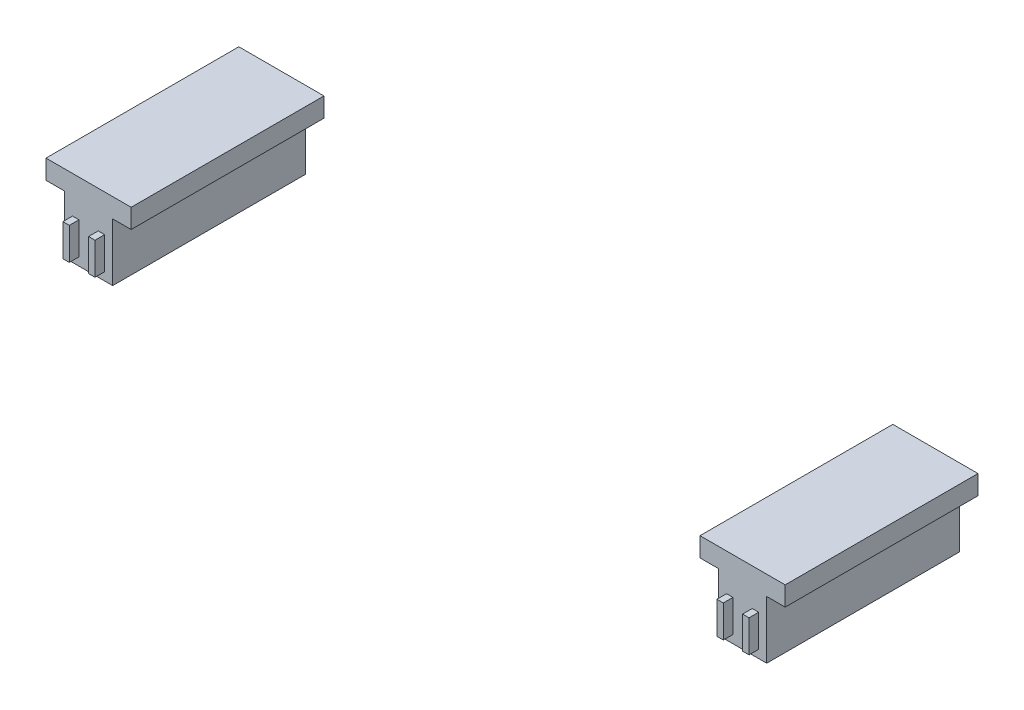
ISO-10303-21;
HEADER;
FILE_DESCRIPTION(('STEP AP214'),'2;1');
FILE_NAME('part.step','',(''),(''),'','','');
FILE_SCHEMA(('AUTOMOTIVE_DESIGN { 1 0 10303 214 1 1 1 1 }'));
ENDSEC;
DATA;
#1=APPLICATION_CONTEXT('core data for automotive mechanical design processes');
#2=APPLICATION_PROTOCOL_DEFINITION('international standard','automotive_design',2000,#1);
#3=PRODUCT_CONTEXT('',#1,'mechanical');
#4=PRODUCT('Part','Part','',(#3));
#5=PRODUCT_RELATED_PRODUCT_CATEGORY('part','',(#4));
#6=PRODUCT_DEFINITION_FORMATION('','',#4);
#7=PRODUCT_DEFINITION_CONTEXT('part definition',#1,'design');
#8=PRODUCT_DEFINITION('design','',#6,#7);
#9=PRODUCT_DEFINITION_SHAPE('','',#8);
#10=(LENGTH_UNIT() NAMED_UNIT(*) SI_UNIT(.MILLI.,.METRE.));
#11=(NAMED_UNIT(*) PLANE_ANGLE_UNIT() SI_UNIT($,.RADIAN.));
#12=(NAMED_UNIT(*) SI_UNIT($,.STERADIAN.) SOLID_ANGLE_UNIT());
#13=UNCERTAINTY_MEASURE_WITH_UNIT(LENGTH_MEASURE(1.E-05),#10,'distance_accuracy_value','');
#14=(GEOMETRIC_REPRESENTATION_CONTEXT(3) GLOBAL_UNCERTAINTY_ASSIGNED_CONTEXT((#13)) GLOBAL_UNIT_ASSIGNED_CONTEXT((#10,
#11,#12)) REPRESENTATION_CONTEXT('',''));
#15=CARTESIAN_POINT('',(0.,0.,0.));
#16=DIRECTION('',(0.,0.,1.));
#17=DIRECTION('',(1.,0.,0.));
#18=AXIS2_PLACEMENT_3D('',#15,#16,#17);
#19=CARTESIAN_POINT('',(0.,0.,60.));
#20=DIRECTION('',(0.,0.,1.));
#21=DIRECTION('',(1.,0.,0.));
#22=AXIS2_PLACEMENT_3D('',#19,#20,#21);
#23=PLANE('',#22);
#24=DIRECTION('',(1.,0.,0.));
#25=VECTOR('',#24,1.);
#26=CARTESIAN_POINT('',(-50.766255203223,-7.74000489882641,60.));
#27=LINE('',#26,#25);
#28=CARTESIAN_POINT('',(-56.516255203223,-7.74000489882641,60.));
#29=VERTEX_POINT('',#28);
#30=CARTESIAN_POINT('',(-50.766255203223,-7.74000489882641,60.));
#31=VERTEX_POINT('',#30);
#32=EDGE_CURVE('E214',#29,#31,#27,.T.);
#33=ORIENTED_EDGE('',*,*,#32,.T.);
#34=DIRECTION('',(0.,1.,0.));
#35=VECTOR('',#34,1.);
#36=CARTESIAN_POINT('',(-50.766255203223,-1.74000489882641,60.));
#37=LINE('',#36,#35);
#38=CARTESIAN_POINT('',(-50.766255203223,-1.74000489882641,60.));
#39=VERTEX_POINT('',#38);
#40=EDGE_CURVE('E217',#31,#39,#37,.T.);
#41=ORIENTED_EDGE('',*,*,#40,.T.);
#42=DIRECTION('',(-1.,0.,0.));
#43=VECTOR('',#42,1.);
#44=CARTESIAN_POINT('',(-77.266255203223,-1.74000489882641,60.));
#45=LINE('',#44,#43);
#46=CARTESIAN_POINT('',(-77.266255203223,-1.74000489882641,60.));
#47=VERTEX_POINT('',#46);
#48=EDGE_CURVE('E220',#39,#47,#45,.T.);
#49=ORIENTED_EDGE('',*,*,#48,.T.);
#50=DIRECTION('',(0.,-1.,0.));
#51=VECTOR('',#50,1.);
#52=CARTESIAN_POINT('',(-77.266255203223,-7.74000489882641,60.));
#53=LINE('',#52,#51);
#54=CARTESIAN_POINT('',(-77.266255203223,-7.74000489882641,60.));
#55=VERTEX_POINT('',#54);
#56=EDGE_CURVE('E222',#47,#55,#53,.T.);
#57=ORIENTED_EDGE('',*,*,#56,.T.);
#58=DIRECTION('',(1.,0.,0.));
#59=VECTOR('',#58,1.);
#60=CARTESIAN_POINT('',(-71.516255203223,-7.74000489882641,60.));
#61=LINE('',#60,#59);
#62=CARTESIAN_POINT('',(-71.516255203223,-7.74000489882641,60.));
#63=VERTEX_POINT('',#62);
#64=EDGE_CURVE('E224',#55,#63,#61,.T.);
#65=ORIENTED_EDGE('',*,*,#64,.T.);
#66=DIRECTION('',(0.,-1.,0.));
#67=VECTOR('',#66,1.);
#68=CARTESIAN_POINT('',(-71.516255203223,-25.7400048988264,60.));
#69=LINE('',#68,#67);
#70=CARTESIAN_POINT('',(-71.516255203223,-25.7400048988264,60.));
#71=VERTEX_POINT('',#70);
#72=EDGE_CURVE('E226',#63,#71,#69,.T.);
#73=ORIENTED_EDGE('',*,*,#72,.T.);
#74=DIRECTION('',(1.,0.,0.));
#75=VECTOR('',#74,1.);
#76=CARTESIAN_POINT('',(-56.516255203223,-25.7400048988264,60.));
#77=LINE('',#76,#75);
#78=CARTESIAN_POINT('',(-56.516255203223,-25.7400048988264,60.));
#79=VERTEX_POINT('',#78);
#80=EDGE_CURVE('E228',#71,#79,#77,.T.);
#81=ORIENTED_EDGE('',*,*,#80,.T.);
#82=DIRECTION('',(0.,1.,0.));
#83=VECTOR('',#82,1.);
#84=CARTESIAN_POINT('',(-56.516255203223,-7.74000489882641,60.));
#85=LINE('',#84,#83);
#86=EDGE_CURVE('E230',#79,#29,#85,.T.);
#87=ORIENTED_EDGE('',*,*,#86,.T.);
#88=EDGE_LOOP('',(#33,#41,#49,#57,#65,#73,#81,#87));
#89=FACE_BOUND('',#88,.T.);
#90=DIRECTION('',(0.,1.,0.));
#91=VECTOR('',#90,1.);
#92=CARTESIAN_POINT('',(-67.016255203223,-13.2400048988264,60.));
#93=LINE('',#92,#91);
#94=CARTESIAN_POINT('',(-67.016255203223,-23.2400048988264,60.));
#95=VERTEX_POINT('',#94);
#96=CARTESIAN_POINT('',(-67.016255203223,-13.2400048988264,60.));
#97=VERTEX_POINT('',#96);
#98=EDGE_CURVE('E185',#95,#97,#93,.T.);
#99=ORIENTED_EDGE('',*,*,#98,.F.);
#100=DIRECTION('',(1.,0.,0.));
#101=VECTOR('',#100,1.);
#102=CARTESIAN_POINT('',(-67.016255203223,-23.2400048988264,60.));
#103=LINE('',#102,#101);
#104=CARTESIAN_POINT('',(-69.016255203223,-23.2400048988264,60.));
#105=VERTEX_POINT('',#104);
#106=EDGE_CURVE('E182',#105,#95,#103,.T.);
#107=ORIENTED_EDGE('',*,*,#106,.F.);
#108=DIRECTION('',(0.,-1.,0.));
#109=VECTOR('',#108,1.);
#110=CARTESIAN_POINT('',(-69.016255203223,-23.2400048988264,60.));
#111=LINE('',#110,#109);
#112=CARTESIAN_POINT('',(-69.016255203223,-13.2400048988264,60.));
#113=VERTEX_POINT('',#112);
#114=EDGE_CURVE('E194',#113,#105,#111,.T.);
#115=ORIENTED_EDGE('',*,*,#114,.F.);
#116=DIRECTION('',(-1.,0.,0.));
#117=VECTOR('',#116,1.);
#118=CARTESIAN_POINT('',(-69.016255203223,-13.2400048988264,60.));
#119=LINE('',#118,#117);
#120=EDGE_CURVE('E202',#97,#113,#119,.T.);
#121=ORIENTED_EDGE('',*,*,#120,.F.);
#122=EDGE_LOOP('',(#99,#107,#115,#121));
#123=FACE_BOUND('',#122,.T.);
#124=DIRECTION('',(0.,-1.,0.));
#125=VECTOR('',#124,1.);
#126=CARTESIAN_POINT('',(-61.016255203223,-23.2400048988264,60.));
#127=LINE('',#126,#125);
#128=CARTESIAN_POINT('',(-61.016255203223,-13.2400048988264,60.));
#129=VERTEX_POINT('',#128);
#130=CARTESIAN_POINT('',(-61.016255203223,-23.2400048988264,60.));
#131=VERTEX_POINT('',#130);
#132=EDGE_CURVE('E483',#129,#131,#127,.T.);
#133=ORIENTED_EDGE('',*,*,#132,.F.);
#134=DIRECTION('',(-1.,0.,0.));
#135=VECTOR('',#134,1.);
#136=CARTESIAN_POINT('',(-61.016255203223,-13.2400048988264,60.));
#137=LINE('',#136,#135);
#138=CARTESIAN_POINT('',(-59.016255203223,-13.2400048988264,60.));
#139=VERTEX_POINT('',#138);
#140=EDGE_CURVE('E180',#139,#129,#137,.T.);
#141=ORIENTED_EDGE('',*,*,#140,.F.);
#142=DIRECTION('',(0.,1.,0.));
#143=VECTOR('',#142,1.);
#144=CARTESIAN_POINT('',(-59.016255203223,-13.2400048988264,60.));
#145=LINE('',#144,#143);
#146=CARTESIAN_POINT('',(-59.016255203223,-23.2400048988264,60.));
#147=VERTEX_POINT('',#146);
#148=EDGE_CURVE('E176',#147,#139,#145,.T.);
#149=ORIENTED_EDGE('',*,*,#148,.F.);
#150=DIRECTION('',(1.,0.,0.));
#151=VECTOR('',#150,1.);
#152=CARTESIAN_POINT('',(-59.016255203223,-23.2400048988264,60.));
#153=LINE('',#152,#151);
#154=EDGE_CURVE('E480',#131,#147,#153,.T.);
#155=ORIENTED_EDGE('',*,*,#154,.F.);
#156=EDGE_LOOP('',(#133,#141,#149,#155));
#157=FACE_BOUND('',#156,.T.);
#158=ADVANCED_FACE('F43',(#89,#123,#157),#23,.T.);
#159=CARTESIAN_POINT('',(-50.766255203223,-7.74000489882641,60.));
#160=DIRECTION('',(0.,1.,0.));
#161=DIRECTION('',(0.,0.,1.));
#162=AXIS2_PLACEMENT_3D('',#159,#160,#161);
#163=PLANE('',#162);
#164=DIRECTION('',(1.,0.,0.));
#165=VECTOR('',#164,1.);
#166=CARTESIAN_POINT('',(-50.766255203223,-7.74000489882641,0.));
#167=LINE('',#166,#165);
#168=CARTESIAN_POINT('',(-56.516255203223,-7.74000489882641,0.));
#169=VERTEX_POINT('',#168);
#170=CARTESIAN_POINT('',(-50.766255203223,-7.74000489882641,0.));
#171=VERTEX_POINT('',#170);
#172=EDGE_CURVE('E213',#169,#171,#167,.T.);
#173=ORIENTED_EDGE('',*,*,#172,.T.);
#174=DIRECTION('',(0.,0.,-1.));
#175=VECTOR('',#174,1.);
#176=CARTESIAN_POINT('',(-50.766255203223,-7.74000489882641,60.));
#177=LINE('',#176,#175);
#178=EDGE_CURVE('E12',#31,#171,#177,.T.);
#179=ORIENTED_EDGE('',*,*,#178,.F.);
#180=ORIENTED_EDGE('',*,*,#32,.F.);
#181=DIRECTION('',(0.,0.,-1.));
#182=VECTOR('',#181,1.);
#183=CARTESIAN_POINT('',(-56.516255203223,-7.74000489882641,60.));
#184=LINE('',#183,#182);
#185=EDGE_CURVE('E232',#29,#169,#184,.T.);
#186=ORIENTED_EDGE('',*,*,#185,.T.);
#187=EDGE_LOOP('',(#173,#179,#180,#186));
#188=FACE_BOUND('',#187,.T.);
#189=ADVANCED_FACE('F45',(#188),#163,.F.);
#190=CARTESIAN_POINT('',(-50.766255203223,-1.74000489882641,60.));
#191=DIRECTION('',(-1.,0.,0.));
#192=DIRECTION('',(0.,0.,1.));
#193=AXIS2_PLACEMENT_3D('',#190,#191,#192);
#194=PLANE('',#193);
#195=DIRECTION('',(0.,1.,0.));
#196=VECTOR('',#195,1.);
#197=CARTESIAN_POINT('',(-50.766255203223,-1.74000489882641,0.));
#198=LINE('',#197,#196);
#199=CARTESIAN_POINT('',(-50.766255203223,-1.74000489882641,0.));
#200=VERTEX_POINT('',#199);
#201=EDGE_CURVE('E235',#171,#200,#198,.T.);
#202=ORIENTED_EDGE('',*,*,#201,.T.);
#203=DIRECTION('',(0.,0.,-1.));
#204=VECTOR('',#203,1.);
#205=CARTESIAN_POINT('',(-50.766255203223,-1.74000489882641,60.));
#206=LINE('',#205,#204);
#207=EDGE_CURVE('E51',#39,#200,#206,.T.);
#208=ORIENTED_EDGE('',*,*,#207,.F.);
#209=ORIENTED_EDGE('',*,*,#40,.F.);
#210=ORIENTED_EDGE('',*,*,#178,.T.);
#211=EDGE_LOOP('',(#202,#208,#209,#210));
#212=FACE_BOUND('',#211,.T.);
#213=ADVANCED_FACE('F292',(#212),#194,.F.);
#214=CARTESIAN_POINT('',(-77.266255203223,-1.74000489882641,60.));
#215=DIRECTION('',(0.,-1.,0.));
#216=DIRECTION('',(0.,0.,-1.));
#217=AXIS2_PLACEMENT_3D('',#214,#215,#216);
#218=PLANE('',#217);
#219=DIRECTION('',(-1.,0.,0.));
#220=VECTOR('',#219,1.);
#221=CARTESIAN_POINT('',(-77.266255203223,-1.74000489882641,0.));
#222=LINE('',#221,#220);
#223=CARTESIAN_POINT('',(-77.266255203223,-1.74000489882641,0.));
#224=VERTEX_POINT('',#223);
#225=EDGE_CURVE('E237',#200,#224,#222,.T.);
#226=ORIENTED_EDGE('',*,*,#225,.T.);
#227=DIRECTION('',(0.,0.,-1.));
#228=VECTOR('',#227,1.);
#229=CARTESIAN_POINT('',(-77.266255203223,-1.74000489882641,60.));
#230=LINE('',#229,#228);
#231=EDGE_CURVE('E262',#47,#224,#230,.T.);
#232=ORIENTED_EDGE('',*,*,#231,.F.);
#233=ORIENTED_EDGE('',*,*,#48,.F.);
#234=ORIENTED_EDGE('',*,*,#207,.T.);
#235=EDGE_LOOP('',(#226,#232,#233,#234));
#236=FACE_BOUND('',#235,.T.);
#237=ADVANCED_FACE('F269',(#236),#218,.F.);
#238=CARTESIAN_POINT('',(-77.266255203223,-7.74000489882641,60.));
#239=DIRECTION('',(1.,0.,0.));
#240=DIRECTION('',(0.,0.,-1.));
#241=AXIS2_PLACEMENT_3D('',#238,#239,#240);
#242=PLANE('',#241);
#243=DIRECTION('',(0.,-1.,0.));
#244=VECTOR('',#243,1.);
#245=CARTESIAN_POINT('',(-77.266255203223,-7.74000489882641,0.));
#246=LINE('',#245,#244);
#247=CARTESIAN_POINT('',(-77.266255203223,-7.74000489882641,0.));
#248=VERTEX_POINT('',#247);
#249=EDGE_CURVE('E239',#224,#248,#246,.T.);
#250=ORIENTED_EDGE('',*,*,#249,.T.);
#251=DIRECTION('',(0.,0.,-1.));
#252=VECTOR('',#251,1.);
#253=CARTESIAN_POINT('',(-77.266255203223,-7.74000489882641,60.));
#254=LINE('',#253,#252);
#255=EDGE_CURVE('E259',#55,#248,#254,.T.);
#256=ORIENTED_EDGE('',*,*,#255,.F.);
#257=ORIENTED_EDGE('',*,*,#56,.F.);
#258=ORIENTED_EDGE('',*,*,#231,.T.);
#259=EDGE_LOOP('',(#250,#256,#257,#258));
#260=FACE_BOUND('',#259,.T.);
#261=ADVANCED_FACE('F280',(#260),#242,.F.);
#262=CARTESIAN_POINT('',(-71.516255203223,-7.74000489882641,60.));
#263=DIRECTION('',(0.,1.,0.));
#264=DIRECTION('',(0.,0.,1.));
#265=AXIS2_PLACEMENT_3D('',#262,#263,#264);
#266=PLANE('',#265);
#267=DIRECTION('',(1.,0.,0.));
#268=VECTOR('',#267,1.);
#269=CARTESIAN_POINT('',(-71.516255203223,-7.74000489882641,0.));
#270=LINE('',#269,#268);
#271=CARTESIAN_POINT('',(-71.516255203223,-7.74000489882641,0.));
#272=VERTEX_POINT('',#271);
#273=EDGE_CURVE('E241',#248,#272,#270,.T.);
#274=ORIENTED_EDGE('',*,*,#273,.T.);
#275=DIRECTION('',(0.,0.,-1.));
#276=VECTOR('',#275,1.);
#277=CARTESIAN_POINT('',(-71.516255203223,-7.74000489882641,60.));
#278=LINE('',#277,#276);
#279=EDGE_CURVE('E256',#63,#272,#278,.T.);
#280=ORIENTED_EDGE('',*,*,#279,.F.);
#281=ORIENTED_EDGE('',*,*,#64,.F.);
#282=ORIENTED_EDGE('',*,*,#255,.T.);
#283=EDGE_LOOP('',(#274,#280,#281,#282));
#284=FACE_BOUND('',#283,.T.);
#285=ADVANCED_FACE('F284',(#284),#266,.F.);
#286=CARTESIAN_POINT('',(-71.516255203223,-25.7400048988264,60.));
#287=DIRECTION('',(1.,0.,0.));
#288=DIRECTION('',(0.,0.,-1.));
#289=AXIS2_PLACEMENT_3D('',#286,#287,#288);
#290=PLANE('',#289);
#291=DIRECTION('',(0.,-1.,0.));
#292=VECTOR('',#291,1.);
#293=CARTESIAN_POINT('',(-71.516255203223,-25.7400048988264,0.));
#294=LINE('',#293,#292);
#295=CARTESIAN_POINT('',(-71.516255203223,-25.7400048988264,0.));
#296=VERTEX_POINT('',#295);
#297=EDGE_CURVE('E243',#272,#296,#294,.T.);
#298=ORIENTED_EDGE('',*,*,#297,.T.);
#299=DIRECTION('',(0.,0.,-1.));
#300=VECTOR('',#299,1.);
#301=CARTESIAN_POINT('',(-71.516255203223,-25.7400048988264,60.));
#302=LINE('',#301,#300);
#303=EDGE_CURVE('E253',#71,#296,#302,.T.);
#304=ORIENTED_EDGE('',*,*,#303,.F.);
#305=ORIENTED_EDGE('',*,*,#72,.F.);
#306=ORIENTED_EDGE('',*,*,#279,.T.);
#307=EDGE_LOOP('',(#298,#304,#305,#306));
#308=FACE_BOUND('',#307,.T.);
#309=ADVANCED_FACE('F305',(#308),#290,.F.);
#310=CARTESIAN_POINT('',(-56.516255203223,-25.7400048988264,60.));
#311=DIRECTION('',(0.,1.,0.));
#312=DIRECTION('',(0.,0.,1.));
#313=AXIS2_PLACEMENT_3D('',#310,#311,#312);
#314=PLANE('',#313);
#315=DIRECTION('',(1.,0.,0.));
#316=VECTOR('',#315,1.);
#317=CARTESIAN_POINT('',(-56.516255203223,-25.7400048988264,0.));
#318=LINE('',#317,#316);
#319=CARTESIAN_POINT('',(-56.516255203223,-25.7400048988264,0.));
#320=VERTEX_POINT('',#319);
#321=EDGE_CURVE('E245',#296,#320,#318,.T.);
#322=ORIENTED_EDGE('',*,*,#321,.T.);
#323=DIRECTION('',(0.,0.,-1.));
#324=VECTOR('',#323,1.);
#325=CARTESIAN_POINT('',(-56.516255203223,-25.7400048988264,60.));
#326=LINE('',#325,#324);
#327=EDGE_CURVE('E250',#79,#320,#326,.T.);
#328=ORIENTED_EDGE('',*,*,#327,.F.);
#329=ORIENTED_EDGE('',*,*,#80,.F.);
#330=ORIENTED_EDGE('',*,*,#303,.T.);
#331=EDGE_LOOP('',(#322,#328,#329,#330));
#332=FACE_BOUND('',#331,.T.);
#333=ADVANCED_FACE('F303',(#332),#314,.F.);
#334=CARTESIAN_POINT('',(-56.516255203223,-7.74000489882641,60.));
#335=DIRECTION('',(-1.,0.,0.));
#336=DIRECTION('',(0.,0.,1.));
#337=AXIS2_PLACEMENT_3D('',#334,#335,#336);
#338=PLANE('',#337);
#339=DIRECTION('',(0.,1.,0.));
#340=VECTOR('',#339,1.);
#341=CARTESIAN_POINT('',(-56.516255203223,-7.74000489882641,0.));
#342=LINE('',#341,#340);
#343=EDGE_CURVE('E218',#320,#169,#342,.T.);
#344=ORIENTED_EDGE('',*,*,#343,.T.);
#345=ORIENTED_EDGE('',*,*,#185,.F.);
#346=ORIENTED_EDGE('',*,*,#86,.F.);
#347=ORIENTED_EDGE('',*,*,#327,.T.);
#348=EDGE_LOOP('',(#344,#345,#346,#347));
#349=FACE_BOUND('',#348,.T.);
#350=ADVANCED_FACE('F298',(#349),#338,.F.);
#351=CARTESIAN_POINT('',(0.,0.,0.));
#352=DIRECTION('',(0.,0.,1.));
#353=DIRECTION('',(1.,0.,0.));
#354=AXIS2_PLACEMENT_3D('',#351,#352,#353);
#355=PLANE('',#354);
#356=ORIENTED_EDGE('',*,*,#172,.F.);
#357=ORIENTED_EDGE('',*,*,#343,.F.);
#358=ORIENTED_EDGE('',*,*,#321,.F.);
#359=ORIENTED_EDGE('',*,*,#297,.F.);
#360=ORIENTED_EDGE('',*,*,#273,.F.);
#361=ORIENTED_EDGE('',*,*,#249,.F.);
#362=ORIENTED_EDGE('',*,*,#225,.F.);
#363=ORIENTED_EDGE('',*,*,#201,.F.);
#364=EDGE_LOOP('',(#356,#357,#358,#359,#360,#361,#362,#363));
#365=FACE_BOUND('',#364,.T.);
#366=ADVANCED_FACE('F275',(#365),#355,.F.);
#367=CARTESIAN_POINT('',(-67.016255203223,-23.2400048988264,63.));
#368=DIRECTION('',(0.,1.,0.));
#369=DIRECTION('',(0.,0.,1.));
#370=AXIS2_PLACEMENT_3D('',#367,#368,#369);
#371=PLANE('',#370);
#372=ORIENTED_EDGE('',*,*,#106,.T.);
#373=DIRECTION('',(0.,0.,-1.));
#374=VECTOR('',#373,1.);
#375=CARTESIAN_POINT('',(-67.016255203223,-23.2400048988264,63.));
#376=LINE('',#375,#374);
#377=CARTESIAN_POINT('',(-67.016255203223,-23.2400048988264,63.));
#378=VERTEX_POINT('',#377);
#379=EDGE_CURVE('E211',#378,#95,#376,.T.);
#380=ORIENTED_EDGE('',*,*,#379,.F.);
#381=DIRECTION('',(1.,0.,0.));
#382=VECTOR('',#381,1.);
#383=CARTESIAN_POINT('',(-67.016255203223,-23.2400048988264,63.));
#384=LINE('',#383,#382);
#385=CARTESIAN_POINT('',(-69.016255203223,-23.2400048988264,63.));
#386=VERTEX_POINT('',#385);
#387=EDGE_CURVE('E190',#386,#378,#384,.T.);
#388=ORIENTED_EDGE('',*,*,#387,.F.);
#389=DIRECTION('',(0.,0.,-1.));
#390=VECTOR('',#389,1.);
#391=CARTESIAN_POINT('',(-69.016255203223,-23.2400048988264,63.));
#392=LINE('',#391,#390);
#393=EDGE_CURVE('E199',#386,#105,#392,.T.);
#394=ORIENTED_EDGE('',*,*,#393,.T.);
#395=EDGE_LOOP('',(#372,#380,#388,#394));
#396=FACE_BOUND('',#395,.T.);
#397=ADVANCED_FACE('F321',(#396),#371,.F.);
#398=CARTESIAN_POINT('',(-67.016255203223,-13.2400048988264,63.));
#399=DIRECTION('',(-1.,0.,0.));
#400=DIRECTION('',(0.,0.,1.));
#401=AXIS2_PLACEMENT_3D('',#398,#399,#400);
#402=PLANE('',#401);
#403=ORIENTED_EDGE('',*,*,#98,.T.);
#404=DIRECTION('',(0.,0.,-1.));
#405=VECTOR('',#404,1.);
#406=CARTESIAN_POINT('',(-67.016255203223,-13.2400048988264,63.));
#407=LINE('',#406,#405);
#408=CARTESIAN_POINT('',(-67.016255203223,-13.2400048988264,63.));
#409=VERTEX_POINT('',#408);
#410=EDGE_CURVE('E208',#409,#97,#407,.T.);
#411=ORIENTED_EDGE('',*,*,#410,.F.);
#412=DIRECTION('',(0.,1.,0.));
#413=VECTOR('',#412,1.);
#414=CARTESIAN_POINT('',(-67.016255203223,-13.2400048988264,63.));
#415=LINE('',#414,#413);
#416=EDGE_CURVE('E193',#378,#409,#415,.T.);
#417=ORIENTED_EDGE('',*,*,#416,.F.);
#418=ORIENTED_EDGE('',*,*,#379,.T.);
#419=EDGE_LOOP('',(#403,#411,#417,#418));
#420=FACE_BOUND('',#419,.T.);
#421=ADVANCED_FACE('F340',(#420),#402,.F.);
#422=CARTESIAN_POINT('',(-69.016255203223,-13.2400048988264,63.));
#423=DIRECTION('',(0.,-1.,0.));
#424=DIRECTION('',(0.,0.,-1.));
#425=AXIS2_PLACEMENT_3D('',#422,#423,#424);
#426=PLANE('',#425);
#427=ORIENTED_EDGE('',*,*,#120,.T.);
#428=DIRECTION('',(0.,0.,-1.));
#429=VECTOR('',#428,1.);
#430=CARTESIAN_POINT('',(-69.016255203223,-13.2400048988264,63.));
#431=LINE('',#430,#429);
#432=CARTESIAN_POINT('',(-69.016255203223,-13.2400048988264,63.));
#433=VERTEX_POINT('',#432);
#434=EDGE_CURVE('E66',#433,#113,#431,.T.);
#435=ORIENTED_EDGE('',*,*,#434,.F.);
#436=DIRECTION('',(-1.,0.,0.));
#437=VECTOR('',#436,1.);
#438=CARTESIAN_POINT('',(-69.016255203223,-13.2400048988264,63.));
#439=LINE('',#438,#437);
#440=EDGE_CURVE('E196',#409,#433,#439,.T.);
#441=ORIENTED_EDGE('',*,*,#440,.F.);
#442=ORIENTED_EDGE('',*,*,#410,.T.);
#443=EDGE_LOOP('',(#427,#435,#441,#442));
#444=FACE_BOUND('',#443,.T.);
#445=ADVANCED_FACE('F347',(#444),#426,.F.);
#446=CARTESIAN_POINT('',(-69.016255203223,-23.2400048988264,63.));
#447=DIRECTION('',(1.,0.,0.));
#448=DIRECTION('',(0.,0.,-1.));
#449=AXIS2_PLACEMENT_3D('',#446,#447,#448);
#450=PLANE('',#449);
#451=ORIENTED_EDGE('',*,*,#114,.T.);
#452=ORIENTED_EDGE('',*,*,#393,.F.);
#453=DIRECTION('',(0.,-1.,0.));
#454=VECTOR('',#453,1.);
#455=CARTESIAN_POINT('',(-69.016255203223,-23.2400048988264,63.));
#456=LINE('',#455,#454);
#457=EDGE_CURVE('E198',#433,#386,#456,.T.);
#458=ORIENTED_EDGE('',*,*,#457,.F.);
#459=ORIENTED_EDGE('',*,*,#434,.T.);
#460=EDGE_LOOP('',(#451,#452,#458,#459));
#461=FACE_BOUND('',#460,.T.);
#462=ADVANCED_FACE('F354',(#461),#450,.F.);
#463=CARTESIAN_POINT('',(0.,0.,63.));
#464=DIRECTION('',(0.,0.,-1.));
#465=DIRECTION('',(-1.,0.,0.));
#466=AXIS2_PLACEMENT_3D('',#463,#464,#465);
#467=PLANE('',#466);
#468=ORIENTED_EDGE('',*,*,#387,.T.);
#469=ORIENTED_EDGE('',*,*,#416,.T.);
#470=ORIENTED_EDGE('',*,*,#440,.T.);
#471=ORIENTED_EDGE('',*,*,#457,.T.);
#472=EDGE_LOOP('',(#468,#469,#470,#471));
#473=FACE_BOUND('',#472,.T.);
#474=ADVANCED_FACE('F362',(#473),#467,.F.);
#475=CARTESIAN_POINT('',(-61.016255203223,-13.2400048988264,63.));
#476=DIRECTION('',(0.,-1.,0.));
#477=DIRECTION('',(0.,0.,-1.));
#478=AXIS2_PLACEMENT_3D('',#475,#476,#477);
#479=PLANE('',#478);
#480=ORIENTED_EDGE('',*,*,#140,.T.);
#481=DIRECTION('',(0.,0.,-1.));
#482=VECTOR('',#481,1.);
#483=CARTESIAN_POINT('',(-61.016255203223,-13.2400048988264,63.));
#484=LINE('',#483,#482);
#485=CARTESIAN_POINT('',(-61.016255203223,-13.2400048988264,63.));
#486=VERTEX_POINT('',#485);
#487=EDGE_CURVE('E161',#486,#129,#484,.T.);
#488=ORIENTED_EDGE('',*,*,#487,.F.);
#489=DIRECTION('',(-1.,0.,0.));
#490=VECTOR('',#489,1.);
#491=CARTESIAN_POINT('',(-61.016255203223,-13.2400048988264,63.));
#492=LINE('',#491,#490);
#493=CARTESIAN_POINT('',(-59.016255203223,-13.2400048988264,63.));
#494=VERTEX_POINT('',#493);
#495=EDGE_CURVE('E168',#494,#486,#492,.T.);
#496=ORIENTED_EDGE('',*,*,#495,.F.);
#497=DIRECTION('',(0.,0.,-1.));
#498=VECTOR('',#497,1.);
#499=CARTESIAN_POINT('',(-59.016255203223,-13.2400048988264,63.));
#500=LINE('',#499,#498);
#501=EDGE_CURVE('E477',#494,#139,#500,.T.);
#502=ORIENTED_EDGE('',*,*,#501,.T.);
#503=EDGE_LOOP('',(#480,#488,#496,#502));
#504=FACE_BOUND('',#503,.T.);
#505=ADVANCED_FACE('F178',(#504),#479,.F.);
#506=CARTESIAN_POINT('',(-61.016255203223,-23.2400048988264,63.));
#507=DIRECTION('',(1.,0.,0.));
#508=DIRECTION('',(0.,0.,-1.));
#509=AXIS2_PLACEMENT_3D('',#506,#507,#508);
#510=PLANE('',#509);
#511=ORIENTED_EDGE('',*,*,#132,.T.);
#512=DIRECTION('',(0.,0.,-1.));
#513=VECTOR('',#512,1.);
#514=CARTESIAN_POINT('',(-61.016255203223,-23.2400048988264,63.));
#515=LINE('',#514,#513);
#516=CARTESIAN_POINT('',(-61.016255203223,-23.2400048988264,63.));
#517=VERTEX_POINT('',#516);
#518=EDGE_CURVE('E164',#517,#131,#515,.T.);
#519=ORIENTED_EDGE('',*,*,#518,.F.);
#520=DIRECTION('',(0.,-1.,0.));
#521=VECTOR('',#520,1.);
#522=CARTESIAN_POINT('',(-61.016255203223,-23.2400048988264,63.));
#523=LINE('',#522,#521);
#524=EDGE_CURVE('E157',#486,#517,#523,.T.);
#525=ORIENTED_EDGE('',*,*,#524,.F.);
#526=ORIENTED_EDGE('',*,*,#487,.T.);
#527=EDGE_LOOP('',(#511,#519,#525,#526));
#528=FACE_BOUND('',#527,.T.);
#529=ADVANCED_FACE('F159',(#528),#510,.F.);
#530=CARTESIAN_POINT('',(-59.016255203223,-23.2400048988264,63.));
#531=DIRECTION('',(0.,1.,0.));
#532=DIRECTION('',(0.,0.,1.));
#533=AXIS2_PLACEMENT_3D('',#530,#531,#532);
#534=PLANE('',#533);
#535=ORIENTED_EDGE('',*,*,#154,.T.);
#536=DIRECTION('',(0.,0.,-1.));
#537=VECTOR('',#536,1.);
#538=CARTESIAN_POINT('',(-59.016255203223,-23.2400048988264,63.));
#539=LINE('',#538,#537);
#540=CARTESIAN_POINT('',(-59.016255203223,-23.2400048988264,63.));
#541=VERTEX_POINT('',#540);
#542=EDGE_CURVE('E58',#541,#147,#539,.T.);
#543=ORIENTED_EDGE('',*,*,#542,.F.);
#544=DIRECTION('',(1.,0.,0.));
#545=VECTOR('',#544,1.);
#546=CARTESIAN_POINT('',(-59.016255203223,-23.2400048988264,63.));
#547=LINE('',#546,#545);
#548=EDGE_CURVE('E167',#517,#541,#547,.T.);
#549=ORIENTED_EDGE('',*,*,#548,.F.);
#550=ORIENTED_EDGE('',*,*,#518,.T.);
#551=EDGE_LOOP('',(#535,#543,#549,#550));
#552=FACE_BOUND('',#551,.T.);
#553=ADVANCED_FACE('F382',(#552),#534,.F.);
#554=CARTESIAN_POINT('',(-59.016255203223,-13.2400048988264,63.));
#555=DIRECTION('',(-1.,0.,0.));
#556=DIRECTION('',(0.,0.,1.));
#557=AXIS2_PLACEMENT_3D('',#554,#555,#556);
#558=PLANE('',#557);
#559=ORIENTED_EDGE('',*,*,#148,.T.);
#560=ORIENTED_EDGE('',*,*,#501,.F.);
#561=DIRECTION('',(0.,1.,0.));
#562=VECTOR('',#561,1.);
#563=CARTESIAN_POINT('',(-59.016255203223,-13.2400048988264,63.));
#564=LINE('',#563,#562);
#565=EDGE_CURVE('E172',#541,#494,#564,.T.);
#566=ORIENTED_EDGE('',*,*,#565,.F.);
#567=ORIENTED_EDGE('',*,*,#542,.T.);
#568=EDGE_LOOP('',(#559,#560,#566,#567));
#569=FACE_BOUND('',#568,.T.);
#570=ADVANCED_FACE('F389',(#569),#558,.F.);
#571=CARTESIAN_POINT('',(0.,0.,63.));
#572=DIRECTION('',(0.,0.,-1.));
#573=DIRECTION('',(-1.,0.,0.));
#574=AXIS2_PLACEMENT_3D('',#571,#572,#573);
#575=PLANE('',#574);
#576=ORIENTED_EDGE('',*,*,#495,.T.);
#577=ORIENTED_EDGE('',*,*,#524,.T.);
#578=ORIENTED_EDGE('',*,*,#548,.T.);
#579=ORIENTED_EDGE('',*,*,#565,.T.);
#580=EDGE_LOOP('',(#576,#577,#578,#579));
#581=FACE_BOUND('',#580,.T.);
#582=ADVANCED_FACE('F171',(#581),#575,.F.);
#583=CLOSED_SHELL('',(#158,#189,#213,#237,#261,#285,#309,#333,#350,#366,#397,#421,#445,#462,
#474,#505,#529,#553,#570,#582));
#584=MANIFOLD_SOLID_BREP('B2',#583);
#585=CARTESIAN_POINT('',(0.,0.,60.));
#586=DIRECTION('',(0.,0.,1.));
#587=DIRECTION('',(1.,0.,0.));
#588=AXIS2_PLACEMENT_3D('',#585,#586,#587);
#589=PLANE('',#588);
#590=DIRECTION('',(0.,-1.,0.));
#591=VECTOR('',#590,1.);
#592=CARTESIAN_POINT('',(126.233744796777,-1.74000489882641,60.));
#593=LINE('',#592,#591);
#594=CARTESIAN_POINT('',(126.233744796777,-1.74000489882641,60.));
#595=VERTEX_POINT('',#594);
#596=CARTESIAN_POINT('',(126.233744796777,-7.74000489882641,60.));
#597=VERTEX_POINT('',#596);
#598=EDGE_CURVE('E672',#595,#597,#593,.T.);
#599=ORIENTED_EDGE('',*,*,#598,.T.);
#600=DIRECTION('',(1.,0.,0.));
#601=VECTOR('',#600,1.);
#602=CARTESIAN_POINT('',(126.233744796777,-7.74000489882641,60.));
#603=LINE('',#602,#601);
#604=CARTESIAN_POINT('',(131.983744796777,-7.74000489882641,60.));
#605=VERTEX_POINT('',#604);
#606=EDGE_CURVE('E675',#597,#605,#603,.T.);
#607=ORIENTED_EDGE('',*,*,#606,.T.);
#608=DIRECTION('',(0.,-1.,0.));
#609=VECTOR('',#608,1.);
#610=CARTESIAN_POINT('',(131.983744796777,-7.74000489882641,60.));
#611=LINE('',#610,#609);
#612=CARTESIAN_POINT('',(131.983744796777,-25.7400048988264,60.));
#613=VERTEX_POINT('',#612);
#614=EDGE_CURVE('E678',#605,#613,#611,.T.);
#615=ORIENTED_EDGE('',*,*,#614,.T.);
#616=DIRECTION('',(1.,0.,0.));
#617=VECTOR('',#616,1.);
#618=CARTESIAN_POINT('',(146.983744796777,-25.7400048988264,60.));
#619=LINE('',#618,#617);
#620=CARTESIAN_POINT('',(146.983744796777,-25.7400048988264,60.));
#621=VERTEX_POINT('',#620);
#622=EDGE_CURVE('E680',#613,#621,#619,.T.);
#623=ORIENTED_EDGE('',*,*,#622,.T.);
#624=DIRECTION('',(0.,1.,0.));
#625=VECTOR('',#624,1.);
#626=CARTESIAN_POINT('',(146.983744796777,-25.7400048988264,60.));
#627=LINE('',#626,#625);
#628=CARTESIAN_POINT('',(146.983744796777,-7.74000489882641,60.));
#629=VERTEX_POINT('',#628);
#630=EDGE_CURVE('E682',#621,#629,#627,.T.);
#631=ORIENTED_EDGE('',*,*,#630,.T.);
#632=DIRECTION('',(1.,0.,0.));
#633=VECTOR('',#632,1.);
#634=CARTESIAN_POINT('',(146.983744796777,-7.74000489882641,60.));
#635=LINE('',#634,#633);
#636=CARTESIAN_POINT('',(152.733744796777,-7.74000489882641,60.));
#637=VERTEX_POINT('',#636);
#638=EDGE_CURVE('E684',#629,#637,#635,.T.);
#639=ORIENTED_EDGE('',*,*,#638,.T.);
#640=DIRECTION('',(0.,1.,0.));
#641=VECTOR('',#640,1.);
#642=CARTESIAN_POINT('',(152.733744796777,-7.74000489882641,60.));
#643=LINE('',#642,#641);
#644=CARTESIAN_POINT('',(152.733744796777,-1.74000489882641,60.));
#645=VERTEX_POINT('',#644);
#646=EDGE_CURVE('E686',#637,#645,#643,.T.);
#647=ORIENTED_EDGE('',*,*,#646,.T.);
#648=DIRECTION('',(-1.,0.,0.));
#649=VECTOR('',#648,1.);
#650=CARTESIAN_POINT('',(152.733744796777,-1.74000489882641,60.));
#651=LINE('',#650,#649);
#652=EDGE_CURVE('E688',#645,#595,#651,.T.);
#653=ORIENTED_EDGE('',*,*,#652,.T.);
#654=EDGE_LOOP('',(#599,#607,#615,#623,#631,#639,#647,#653));
#655=FACE_BOUND('',#654,.T.);
#656=DIRECTION('',(0.,1.,0.));
#657=VECTOR('',#656,1.);
#658=CARTESIAN_POINT('',(136.483744796777,-13.2400048988264,60.));
#659=LINE('',#658,#657);
#660=CARTESIAN_POINT('',(136.483744796777,-23.2400048988264,60.));
#661=VERTEX_POINT('',#660);
#662=CARTESIAN_POINT('',(136.483744796777,-13.2400048988264,60.));
#663=VERTEX_POINT('',#662);
#664=EDGE_CURVE('E643',#661,#663,#659,.T.);
#665=ORIENTED_EDGE('',*,*,#664,.F.);
#666=DIRECTION('',(1.,0.,0.));
#667=VECTOR('',#666,1.);
#668=CARTESIAN_POINT('',(136.483744796777,-23.2400048988264,60.));
#669=LINE('',#668,#667);
#670=CARTESIAN_POINT('',(134.483744796777,-23.2400048988264,60.));
#671=VERTEX_POINT('',#670);
#672=EDGE_CURVE('E640',#671,#661,#669,.T.);
#673=ORIENTED_EDGE('',*,*,#672,.F.);
#674=DIRECTION('',(0.,-1.,0.));
#675=VECTOR('',#674,1.);
#676=CARTESIAN_POINT('',(134.483744796777,-23.2400048988264,60.));
#677=LINE('',#676,#675);
#678=CARTESIAN_POINT('',(134.483744796777,-13.2400048988264,60.));
#679=VERTEX_POINT('',#678);
#680=EDGE_CURVE('E652',#679,#671,#677,.T.);
#681=ORIENTED_EDGE('',*,*,#680,.F.);
#682=DIRECTION('',(-1.,0.,0.));
#683=VECTOR('',#682,1.);
#684=CARTESIAN_POINT('',(134.483744796777,-13.2400048988264,60.));
#685=LINE('',#684,#683);
#686=EDGE_CURVE('E660',#663,#679,#685,.T.);
#687=ORIENTED_EDGE('',*,*,#686,.F.);
#688=EDGE_LOOP('',(#665,#673,#681,#687));
#689=FACE_BOUND('',#688,.T.);
#690=DIRECTION('',(0.,-1.,0.));
#691=VECTOR('',#690,1.);
#692=CARTESIAN_POINT('',(142.483744796777,-23.2400048988264,60.));
#693=LINE('',#692,#691);
#694=CARTESIAN_POINT('',(142.483744796777,-13.2400048988264,60.));
#695=VERTEX_POINT('',#694);
#696=CARTESIAN_POINT('',(142.483744796777,-23.2400048988264,60.));
#697=VERTEX_POINT('',#696);
#698=EDGE_CURVE('E941',#695,#697,#693,.T.);
#699=ORIENTED_EDGE('',*,*,#698,.F.);
#700=DIRECTION('',(-1.,0.,0.));
#701=VECTOR('',#700,1.);
#702=CARTESIAN_POINT('',(142.483744796777,-13.2400048988264,60.));
#703=LINE('',#702,#701);
#704=CARTESIAN_POINT('',(144.483744796777,-13.2400048988264,60.));
#705=VERTEX_POINT('',#704);
#706=EDGE_CURVE('E638',#705,#695,#703,.T.);
#707=ORIENTED_EDGE('',*,*,#706,.F.);
#708=DIRECTION('',(0.,1.,0.));
#709=VECTOR('',#708,1.);
#710=CARTESIAN_POINT('',(144.483744796777,-13.2400048988264,60.));
#711=LINE('',#710,#709);
#712=CARTESIAN_POINT('',(144.483744796777,-23.2400048988264,60.));
#713=VERTEX_POINT('',#712);
#714=EDGE_CURVE('E634',#713,#705,#711,.T.);
#715=ORIENTED_EDGE('',*,*,#714,.F.);
#716=DIRECTION('',(1.,0.,0.));
#717=VECTOR('',#716,1.);
#718=CARTESIAN_POINT('',(144.483744796777,-23.2400048988264,60.));
#719=LINE('',#718,#717);
#720=EDGE_CURVE('E938',#697,#713,#719,.T.);
#721=ORIENTED_EDGE('',*,*,#720,.F.);
#722=EDGE_LOOP('',(#699,#707,#715,#721));
#723=FACE_BOUND('',#722,.T.);
#724=ADVANCED_FACE('F501',(#655,#689,#723),#589,.T.);
#725=CARTESIAN_POINT('',(126.233744796777,-1.74000489882641,60.));
#726=DIRECTION('',(1.,0.,0.));
#727=DIRECTION('',(0.,0.,-1.));
#728=AXIS2_PLACEMENT_3D('',#725,#726,#727);
#729=PLANE('',#728);
#730=DIRECTION('',(0.,-1.,0.));
#731=VECTOR('',#730,1.);
#732=CARTESIAN_POINT('',(126.233744796777,-1.74000489882641,0.));
#733=LINE('',#732,#731);
#734=CARTESIAN_POINT('',(126.233744796777,-1.74000489882641,0.));
#735=VERTEX_POINT('',#734);
#736=CARTESIAN_POINT('',(126.233744796777,-7.74000489882641,0.));
#737=VERTEX_POINT('',#736);
#738=EDGE_CURVE('E671',#735,#737,#733,.T.);
#739=ORIENTED_EDGE('',*,*,#738,.T.);
#740=DIRECTION('',(0.,0.,-1.));
#741=VECTOR('',#740,1.);
#742=CARTESIAN_POINT('',(126.233744796777,-7.74000489882641,60.));
#743=LINE('',#742,#741);
#744=EDGE_CURVE('E41',#597,#737,#743,.T.);
#745=ORIENTED_EDGE('',*,*,#744,.F.);
#746=ORIENTED_EDGE('',*,*,#598,.F.);
#747=DIRECTION('',(0.,0.,-1.));
#748=VECTOR('',#747,1.);
#749=CARTESIAN_POINT('',(126.233744796777,-1.74000489882641,60.));
#750=LINE('',#749,#748);
#751=EDGE_CURVE('E690',#595,#735,#750,.T.);
#752=ORIENTED_EDGE('',*,*,#751,.T.);
#753=EDGE_LOOP('',(#739,#745,#746,#752));
#754=FACE_BOUND('',#753,.T.);
#755=ADVANCED_FACE('F503',(#754),#729,.F.);
#756=CARTESIAN_POINT('',(126.233744796777,-7.74000489882641,60.));
#757=DIRECTION('',(0.,1.,0.));
#758=DIRECTION('',(0.,0.,1.));
#759=AXIS2_PLACEMENT_3D('',#756,#757,#758);
#760=PLANE('',#759);
#761=DIRECTION('',(1.,0.,0.));
#762=VECTOR('',#761,1.);
#763=CARTESIAN_POINT('',(126.233744796777,-7.74000489882641,0.));
#764=LINE('',#763,#762);
#765=CARTESIAN_POINT('',(131.983744796777,-7.74000489882641,0.));
#766=VERTEX_POINT('',#765);
#767=EDGE_CURVE('E693',#737,#766,#764,.T.);
#768=ORIENTED_EDGE('',*,*,#767,.T.);
#769=DIRECTION('',(0.,0.,-1.));
#770=VECTOR('',#769,1.);
#771=CARTESIAN_POINT('',(131.983744796777,-7.74000489882641,60.));
#772=LINE('',#771,#770);
#773=EDGE_CURVE('E509',#605,#766,#772,.T.);
#774=ORIENTED_EDGE('',*,*,#773,.F.);
#775=ORIENTED_EDGE('',*,*,#606,.F.);
#776=ORIENTED_EDGE('',*,*,#744,.T.);
#777=EDGE_LOOP('',(#768,#774,#775,#776));
#778=FACE_BOUND('',#777,.T.);
#779=ADVANCED_FACE('F750',(#778),#760,.F.);
#780=CARTESIAN_POINT('',(131.983744796777,-7.74000489882641,60.));
#781=DIRECTION('',(1.,0.,0.));
#782=DIRECTION('',(0.,0.,-1.));
#783=AXIS2_PLACEMENT_3D('',#780,#781,#782);
#784=PLANE('',#783);
#785=DIRECTION('',(0.,-1.,0.));
#786=VECTOR('',#785,1.);
#787=CARTESIAN_POINT('',(131.983744796777,-7.74000489882641,0.));
#788=LINE('',#787,#786);
#789=CARTESIAN_POINT('',(131.983744796777,-25.7400048988264,0.));
#790=VERTEX_POINT('',#789);
#791=EDGE_CURVE('E695',#766,#790,#788,.T.);
#792=ORIENTED_EDGE('',*,*,#791,.T.);
#793=DIRECTION('',(0.,0.,-1.));
#794=VECTOR('',#793,1.);
#795=CARTESIAN_POINT('',(131.983744796777,-25.7400048988264,60.));
#796=LINE('',#795,#794);
#797=EDGE_CURVE('E720',#613,#790,#796,.T.);
#798=ORIENTED_EDGE('',*,*,#797,.F.);
#799=ORIENTED_EDGE('',*,*,#614,.F.);
#800=ORIENTED_EDGE('',*,*,#773,.T.);
#801=EDGE_LOOP('',(#792,#798,#799,#800));
#802=FACE_BOUND('',#801,.T.);
#803=ADVANCED_FACE('F727',(#802),#784,.F.);
#804=CARTESIAN_POINT('',(146.983744796777,-25.7400048988264,60.));
#805=DIRECTION('',(0.,1.,0.));
#806=DIRECTION('',(0.,0.,1.));
#807=AXIS2_PLACEMENT_3D('',#804,#805,#806);
#808=PLANE('',#807);
#809=DIRECTION('',(1.,0.,0.));
#810=VECTOR('',#809,1.);
#811=CARTESIAN_POINT('',(146.983744796777,-25.7400048988264,0.));
#812=LINE('',#811,#810);
#813=CARTESIAN_POINT('',(146.983744796777,-25.7400048988264,0.));
#814=VERTEX_POINT('',#813);
#815=EDGE_CURVE('E697',#790,#814,#812,.T.);
#816=ORIENTED_EDGE('',*,*,#815,.T.);
#817=DIRECTION('',(0.,0.,-1.));
#818=VECTOR('',#817,1.);
#819=CARTESIAN_POINT('',(146.983744796777,-25.7400048988264,60.));
#820=LINE('',#819,#818);
#821=EDGE_CURVE('E717',#621,#814,#820,.T.);
#822=ORIENTED_EDGE('',*,*,#821,.F.);
#823=ORIENTED_EDGE('',*,*,#622,.F.);
#824=ORIENTED_EDGE('',*,*,#797,.T.);
#825=EDGE_LOOP('',(#816,#822,#823,#824));
#826=FACE_BOUND('',#825,.T.);
#827=ADVANCED_FACE('F738',(#826),#808,.F.);
#828=CARTESIAN_POINT('',(146.983744796777,-25.7400048988264,60.));
#829=DIRECTION('',(-1.,0.,0.));
#830=DIRECTION('',(0.,0.,1.));
#831=AXIS2_PLACEMENT_3D('',#828,#829,#830);
#832=PLANE('',#831);
#833=DIRECTION('',(0.,1.,0.));
#834=VECTOR('',#833,1.);
#835=CARTESIAN_POINT('',(146.983744796777,-25.7400048988264,0.));
#836=LINE('',#835,#834);
#837=CARTESIAN_POINT('',(146.983744796777,-7.74000489882641,0.));
#838=VERTEX_POINT('',#837);
#839=EDGE_CURVE('E699',#814,#838,#836,.T.);
#840=ORIENTED_EDGE('',*,*,#839,.T.);
#841=DIRECTION('',(0.,0.,-1.));
#842=VECTOR('',#841,1.);
#843=CARTESIAN_POINT('',(146.983744796777,-7.74000489882641,60.));
#844=LINE('',#843,#842);
#845=EDGE_CURVE('E714',#629,#838,#844,.T.);
#846=ORIENTED_EDGE('',*,*,#845,.F.);
#847=ORIENTED_EDGE('',*,*,#630,.F.);
#848=ORIENTED_EDGE('',*,*,#821,.T.);
#849=EDGE_LOOP('',(#840,#846,#847,#848));
#850=FACE_BOUND('',#849,.T.);
#851=ADVANCED_FACE('F742',(#850),#832,.F.);
#852=CARTESIAN_POINT('',(146.983744796777,-7.74000489882641,60.));
#853=DIRECTION('',(0.,1.,0.));
#854=DIRECTION('',(0.,0.,1.));
#855=AXIS2_PLACEMENT_3D('',#852,#853,#854);
#856=PLANE('',#855);
#857=DIRECTION('',(1.,0.,0.));
#858=VECTOR('',#857,1.);
#859=CARTESIAN_POINT('',(146.983744796777,-7.74000489882641,0.));
#860=LINE('',#859,#858);
#861=CARTESIAN_POINT('',(152.733744796777,-7.74000489882641,0.));
#862=VERTEX_POINT('',#861);
#863=EDGE_CURVE('E701',#838,#862,#860,.T.);
#864=ORIENTED_EDGE('',*,*,#863,.T.);
#865=DIRECTION('',(0.,0.,-1.));
#866=VECTOR('',#865,1.);
#867=CARTESIAN_POINT('',(152.733744796777,-7.74000489882641,60.));
#868=LINE('',#867,#866);
#869=EDGE_CURVE('E711',#637,#862,#868,.T.);
#870=ORIENTED_EDGE('',*,*,#869,.F.);
#871=ORIENTED_EDGE('',*,*,#638,.F.);
#872=ORIENTED_EDGE('',*,*,#845,.T.);
#873=EDGE_LOOP('',(#864,#870,#871,#872));
#874=FACE_BOUND('',#873,.T.);
#875=ADVANCED_FACE('F763',(#874),#856,.F.);
#876=CARTESIAN_POINT('',(152.733744796777,-7.74000489882641,60.));
#877=DIRECTION('',(-1.,0.,0.));
#878=DIRECTION('',(0.,0.,1.));
#879=AXIS2_PLACEMENT_3D('',#876,#877,#878);
#880=PLANE('',#879);
#881=DIRECTION('',(0.,1.,0.));
#882=VECTOR('',#881,1.);
#883=CARTESIAN_POINT('',(152.733744796777,-7.74000489882641,0.));
#884=LINE('',#883,#882);
#885=CARTESIAN_POINT('',(152.733744796777,-1.74000489882641,0.));
#886=VERTEX_POINT('',#885);
#887=EDGE_CURVE('E703',#862,#886,#884,.T.);
#888=ORIENTED_EDGE('',*,*,#887,.T.);
#889=DIRECTION('',(0.,0.,-1.));
#890=VECTOR('',#889,1.);
#891=CARTESIAN_POINT('',(152.733744796777,-1.74000489882641,60.));
#892=LINE('',#891,#890);
#893=EDGE_CURVE('E708',#645,#886,#892,.T.);
#894=ORIENTED_EDGE('',*,*,#893,.F.);
#895=ORIENTED_EDGE('',*,*,#646,.F.);
#896=ORIENTED_EDGE('',*,*,#869,.T.);
#897=EDGE_LOOP('',(#888,#894,#895,#896));
#898=FACE_BOUND('',#897,.T.);
#899=ADVANCED_FACE('F761',(#898),#880,.F.);
#900=CARTESIAN_POINT('',(152.733744796777,-1.74000489882641,60.));
#901=DIRECTION('',(0.,-1.,0.));
#902=DIRECTION('',(0.,0.,-1.));
#903=AXIS2_PLACEMENT_3D('',#900,#901,#902);
#904=PLANE('',#903);
#905=DIRECTION('',(-1.,0.,0.));
#906=VECTOR('',#905,1.);
#907=CARTESIAN_POINT('',(152.733744796777,-1.74000489882641,0.));
#908=LINE('',#907,#906);
#909=EDGE_CURVE('E676',#886,#735,#908,.T.);
#910=ORIENTED_EDGE('',*,*,#909,.T.);
#911=ORIENTED_EDGE('',*,*,#751,.F.);
#912=ORIENTED_EDGE('',*,*,#652,.F.);
#913=ORIENTED_EDGE('',*,*,#893,.T.);
#914=EDGE_LOOP('',(#910,#911,#912,#913));
#915=FACE_BOUND('',#914,.T.);
#916=ADVANCED_FACE('F756',(#915),#904,.F.);
#917=CARTESIAN_POINT('',(0.,0.,0.));
#918=DIRECTION('',(0.,0.,1.));
#919=DIRECTION('',(1.,0.,0.));
#920=AXIS2_PLACEMENT_3D('',#917,#918,#919);
#921=PLANE('',#920);
#922=ORIENTED_EDGE('',*,*,#738,.F.);
#923=ORIENTED_EDGE('',*,*,#909,.F.);
#924=ORIENTED_EDGE('',*,*,#887,.F.);
#925=ORIENTED_EDGE('',*,*,#863,.F.);
#926=ORIENTED_EDGE('',*,*,#839,.F.);
#927=ORIENTED_EDGE('',*,*,#815,.F.);
#928=ORIENTED_EDGE('',*,*,#791,.F.);
#929=ORIENTED_EDGE('',*,*,#767,.F.);
#930=EDGE_LOOP('',(#922,#923,#924,#925,#926,#927,#928,#929));
#931=FACE_BOUND('',#930,.T.);
#932=ADVANCED_FACE('F733',(#931),#921,.F.);
#933=CARTESIAN_POINT('',(136.483744796777,-23.2400048988264,63.));
#934=DIRECTION('',(0.,1.,0.));
#935=DIRECTION('',(0.,0.,1.));
#936=AXIS2_PLACEMENT_3D('',#933,#934,#935);
#937=PLANE('',#936);
#938=ORIENTED_EDGE('',*,*,#672,.T.);
#939=DIRECTION('',(0.,0.,-1.));
#940=VECTOR('',#939,1.);
#941=CARTESIAN_POINT('',(136.483744796777,-23.2400048988264,63.));
#942=LINE('',#941,#940);
#943=CARTESIAN_POINT('',(136.483744796777,-23.2400048988264,63.));
#944=VERTEX_POINT('',#943);
#945=EDGE_CURVE('E669',#944,#661,#942,.T.);
#946=ORIENTED_EDGE('',*,*,#945,.F.);
#947=DIRECTION('',(1.,0.,0.));
#948=VECTOR('',#947,1.);
#949=CARTESIAN_POINT('',(136.483744796777,-23.2400048988264,63.));
#950=LINE('',#949,#948);
#951=CARTESIAN_POINT('',(134.483744796777,-23.2400048988264,63.));
#952=VERTEX_POINT('',#951);
#953=EDGE_CURVE('E648',#952,#944,#950,.T.);
#954=ORIENTED_EDGE('',*,*,#953,.F.);
#955=DIRECTION('',(0.,0.,-1.));
#956=VECTOR('',#955,1.);
#957=CARTESIAN_POINT('',(134.483744796777,-23.2400048988264,63.));
#958=LINE('',#957,#956);
#959=EDGE_CURVE('E657',#952,#671,#958,.T.);
#960=ORIENTED_EDGE('',*,*,#959,.T.);
#961=EDGE_LOOP('',(#938,#946,#954,#960));
#962=FACE_BOUND('',#961,.T.);
#963=ADVANCED_FACE('F779',(#962),#937,.F.);
#964=CARTESIAN_POINT('',(136.483744796777,-13.2400048988264,63.));
#965=DIRECTION('',(-1.,0.,0.));
#966=DIRECTION('',(0.,0.,1.));
#967=AXIS2_PLACEMENT_3D('',#964,#965,#966);
#968=PLANE('',#967);
#969=ORIENTED_EDGE('',*,*,#664,.T.);
#970=DIRECTION('',(0.,0.,-1.));
#971=VECTOR('',#970,1.);
#972=CARTESIAN_POINT('',(136.483744796777,-13.2400048988264,63.));
#973=LINE('',#972,#971);
#974=CARTESIAN_POINT('',(136.483744796777,-13.2400048988264,63.));
#975=VERTEX_POINT('',#974);
#976=EDGE_CURVE('E666',#975,#663,#973,.T.);
#977=ORIENTED_EDGE('',*,*,#976,.F.);
#978=DIRECTION('',(0.,1.,0.));
#979=VECTOR('',#978,1.);
#980=CARTESIAN_POINT('',(136.483744796777,-13.2400048988264,63.));
#981=LINE('',#980,#979);
#982=EDGE_CURVE('E651',#944,#975,#981,.T.);
#983=ORIENTED_EDGE('',*,*,#982,.F.);
#984=ORIENTED_EDGE('',*,*,#945,.T.);
#985=EDGE_LOOP('',(#969,#977,#983,#984));
#986=FACE_BOUND('',#985,.T.);
#987=ADVANCED_FACE('F798',(#986),#968,.F.);
#988=CARTESIAN_POINT('',(134.483744796777,-13.2400048988264,63.));
#989=DIRECTION('',(0.,-1.,0.));
#990=DIRECTION('',(0.,0.,-1.));
#991=AXIS2_PLACEMENT_3D('',#988,#989,#990);
#992=PLANE('',#991);
#993=ORIENTED_EDGE('',*,*,#686,.T.);
#994=DIRECTION('',(0.,0.,-1.));
#995=VECTOR('',#994,1.);
#996=CARTESIAN_POINT('',(134.483744796777,-13.2400048988264,63.));
#997=LINE('',#996,#995);
#998=CARTESIAN_POINT('',(134.483744796777,-13.2400048988264,63.));
#999=VERTEX_POINT('',#998);
#1000=EDGE_CURVE('E524',#999,#679,#997,.T.);
#1001=ORIENTED_EDGE('',*,*,#1000,.F.);
#1002=DIRECTION('',(-1.,0.,0.));
#1003=VECTOR('',#1002,1.);
#1004=CARTESIAN_POINT('',(134.483744796777,-13.2400048988264,63.));
#1005=LINE('',#1004,#1003);
#1006=EDGE_CURVE('E654',#975,#999,#1005,.T.);
#1007=ORIENTED_EDGE('',*,*,#1006,.F.);
#1008=ORIENTED_EDGE('',*,*,#976,.T.);
#1009=EDGE_LOOP('',(#993,#1001,#1007,#1008));
#1010=FACE_BOUND('',#1009,.T.);
#1011=ADVANCED_FACE('F805',(#1010),#992,.F.);
#1012=CARTESIAN_POINT('',(134.483744796777,-23.2400048988264,63.));
#1013=DIRECTION('',(1.,0.,0.));
#1014=DIRECTION('',(0.,0.,-1.));
#1015=AXIS2_PLACEMENT_3D('',#1012,#1013,#1014);
#1016=PLANE('',#1015);
#1017=ORIENTED_EDGE('',*,*,#680,.T.);
#1018=ORIENTED_EDGE('',*,*,#959,.F.);
#1019=DIRECTION('',(0.,-1.,0.));
#1020=VECTOR('',#1019,1.);
#1021=CARTESIAN_POINT('',(134.483744796777,-23.2400048988264,63.));
#1022=LINE('',#1021,#1020);
#1023=EDGE_CURVE('E656',#999,#952,#1022,.T.);
#1024=ORIENTED_EDGE('',*,*,#1023,.F.);
#1025=ORIENTED_EDGE('',*,*,#1000,.T.);
#1026=EDGE_LOOP('',(#1017,#1018,#1024,#1025));
#1027=FACE_BOUND('',#1026,.T.);
#1028=ADVANCED_FACE('F812',(#1027),#1016,.F.);
#1029=CARTESIAN_POINT('',(0.,0.,63.));
#1030=DIRECTION('',(0.,0.,-1.));
#1031=DIRECTION('',(-1.,0.,0.));
#1032=AXIS2_PLACEMENT_3D('',#1029,#1030,#1031);
#1033=PLANE('',#1032);
#1034=ORIENTED_EDGE('',*,*,#953,.T.);
#1035=ORIENTED_EDGE('',*,*,#982,.T.);
#1036=ORIENTED_EDGE('',*,*,#1006,.T.);
#1037=ORIENTED_EDGE('',*,*,#1023,.T.);
#1038=EDGE_LOOP('',(#1034,#1035,#1036,#1037));
#1039=FACE_BOUND('',#1038,.T.);
#1040=ADVANCED_FACE('F820',(#1039),#1033,.F.);
#1041=CARTESIAN_POINT('',(142.483744796777,-13.2400048988264,63.));
#1042=DIRECTION('',(0.,-1.,0.));
#1043=DIRECTION('',(0.,0.,-1.));
#1044=AXIS2_PLACEMENT_3D('',#1041,#1042,#1043);
#1045=PLANE('',#1044);
#1046=ORIENTED_EDGE('',*,*,#706,.T.);
#1047=DIRECTION('',(0.,0.,-1.));
#1048=VECTOR('',#1047,1.);
#1049=CARTESIAN_POINT('',(142.483744796777,-13.2400048988264,63.));
#1050=LINE('',#1049,#1048);
#1051=CARTESIAN_POINT('',(142.483744796777,-13.2400048988264,63.));
#1052=VERTEX_POINT('',#1051);
#1053=EDGE_CURVE('E619',#1052,#695,#1050,.T.);
#1054=ORIENTED_EDGE('',*,*,#1053,.F.);
#1055=DIRECTION('',(-1.,0.,0.));
#1056=VECTOR('',#1055,1.);
#1057=CARTESIAN_POINT('',(142.483744796777,-13.2400048988264,63.));
#1058=LINE('',#1057,#1056);
#1059=CARTESIAN_POINT('',(144.483744796777,-13.2400048988264,63.));
#1060=VERTEX_POINT('',#1059);
#1061=EDGE_CURVE('E626',#1060,#1052,#1058,.T.);
#1062=ORIENTED_EDGE('',*,*,#1061,.F.);
#1063=DIRECTION('',(0.,0.,-1.));
#1064=VECTOR('',#1063,1.);
#1065=CARTESIAN_POINT('',(144.483744796777,-13.2400048988264,63.));
#1066=LINE('',#1065,#1064);
#1067=EDGE_CURVE('E935',#1060,#705,#1066,.T.);
#1068=ORIENTED_EDGE('',*,*,#1067,.T.);
#1069=EDGE_LOOP('',(#1046,#1054,#1062,#1068));
#1070=FACE_BOUND('',#1069,.T.);
#1071=ADVANCED_FACE('F636',(#1070),#1045,.F.);
#1072=CARTESIAN_POINT('',(142.483744796777,-23.2400048988264,63.));
#1073=DIRECTION('',(1.,0.,0.));
#1074=DIRECTION('',(0.,0.,-1.));
#1075=AXIS2_PLACEMENT_3D('',#1072,#1073,#1074);
#1076=PLANE('',#1075);
#1077=ORIENTED_EDGE('',*,*,#698,.T.);
#1078=DIRECTION('',(0.,0.,-1.));
#1079=VECTOR('',#1078,1.);
#1080=CARTESIAN_POINT('',(142.483744796777,-23.2400048988264,63.));
#1081=LINE('',#1080,#1079);
#1082=CARTESIAN_POINT('',(142.483744796777,-23.2400048988264,63.));
#1083=VERTEX_POINT('',#1082);
#1084=EDGE_CURVE('E622',#1083,#697,#1081,.T.);
#1085=ORIENTED_EDGE('',*,*,#1084,.F.);
#1086=DIRECTION('',(0.,-1.,0.));
#1087=VECTOR('',#1086,1.);
#1088=CARTESIAN_POINT('',(142.483744796777,-23.2400048988264,63.));
#1089=LINE('',#1088,#1087);
#1090=EDGE_CURVE('E615',#1052,#1083,#1089,.T.);
#1091=ORIENTED_EDGE('',*,*,#1090,.F.);
#1092=ORIENTED_EDGE('',*,*,#1053,.T.);
#1093=EDGE_LOOP('',(#1077,#1085,#1091,#1092));
#1094=FACE_BOUND('',#1093,.T.);
#1095=ADVANCED_FACE('F617',(#1094),#1076,.F.);
#1096=CARTESIAN_POINT('',(144.483744796777,-23.2400048988264,63.));
#1097=DIRECTION('',(0.,1.,0.));
#1098=DIRECTION('',(0.,0.,1.));
#1099=AXIS2_PLACEMENT_3D('',#1096,#1097,#1098);
#1100=PLANE('',#1099);
#1101=ORIENTED_EDGE('',*,*,#720,.T.);
#1102=DIRECTION('',(0.,0.,-1.));
#1103=VECTOR('',#1102,1.);
#1104=CARTESIAN_POINT('',(144.483744796777,-23.2400048988264,63.));
#1105=LINE('',#1104,#1103);
#1106=CARTESIAN_POINT('',(144.483744796777,-23.2400048988264,63.));
#1107=VERTEX_POINT('',#1106);
#1108=EDGE_CURVE('E516',#1107,#713,#1105,.T.);
#1109=ORIENTED_EDGE('',*,*,#1108,.F.);
#1110=DIRECTION('',(1.,0.,0.));
#1111=VECTOR('',#1110,1.);
#1112=CARTESIAN_POINT('',(144.483744796777,-23.2400048988264,63.));
#1113=LINE('',#1112,#1111);
#1114=EDGE_CURVE('E625',#1083,#1107,#1113,.T.);
#1115=ORIENTED_EDGE('',*,*,#1114,.F.);
#1116=ORIENTED_EDGE('',*,*,#1084,.T.);
#1117=EDGE_LOOP('',(#1101,#1109,#1115,#1116));
#1118=FACE_BOUND('',#1117,.T.);
#1119=ADVANCED_FACE('F840',(#1118),#1100,.F.);
#1120=CARTESIAN_POINT('',(144.483744796777,-13.2400048988264,63.));
#1121=DIRECTION('',(-1.,0.,0.));
#1122=DIRECTION('',(0.,0.,1.));
#1123=AXIS2_PLACEMENT_3D('',#1120,#1121,#1122);
#1124=PLANE('',#1123);
#1125=ORIENTED_EDGE('',*,*,#714,.T.);
#1126=ORIENTED_EDGE('',*,*,#1067,.F.);
#1127=DIRECTION('',(0.,1.,0.));
#1128=VECTOR('',#1127,1.);
#1129=CARTESIAN_POINT('',(144.483744796777,-13.2400048988264,63.));
#1130=LINE('',#1129,#1128);
#1131=EDGE_CURVE('E630',#1107,#1060,#1130,.T.);
#1132=ORIENTED_EDGE('',*,*,#1131,.F.);
#1133=ORIENTED_EDGE('',*,*,#1108,.T.);
#1134=EDGE_LOOP('',(#1125,#1126,#1132,#1133));
#1135=FACE_BOUND('',#1134,.T.);
#1136=ADVANCED_FACE('F847',(#1135),#1124,.F.);
#1137=CARTESIAN_POINT('',(0.,0.,63.));
#1138=DIRECTION('',(0.,0.,-1.));
#1139=DIRECTION('',(-1.,0.,0.));
#1140=AXIS2_PLACEMENT_3D('',#1137,#1138,#1139);
#1141=PLANE('',#1140);
#1142=ORIENTED_EDGE('',*,*,#1061,.T.);
#1143=ORIENTED_EDGE('',*,*,#1090,.T.);
#1144=ORIENTED_EDGE('',*,*,#1114,.T.);
#1145=ORIENTED_EDGE('',*,*,#1131,.T.);
#1146=EDGE_LOOP('',(#1142,#1143,#1144,#1145));
#1147=FACE_BOUND('',#1146,.T.);
#1148=ADVANCED_FACE('F629',(#1147),#1141,.F.);
#1149=CLOSED_SHELL('',(#724,#755,#779,#803,#827,#851,#875,#899,#916,#932,#963,#987,#1011,#1028,
#1040,#1071,#1095,#1119,#1136,#1148));
#1150=MANIFOLD_SOLID_BREP('B6',#1149);
#1151=ADVANCED_BREP_SHAPE_REPRESENTATION('',(#18,#584,#1150),#14);
#1152=SHAPE_DEFINITION_REPRESENTATION(#9,#1151);
ENDSEC;
END-ISO-10303-21;
